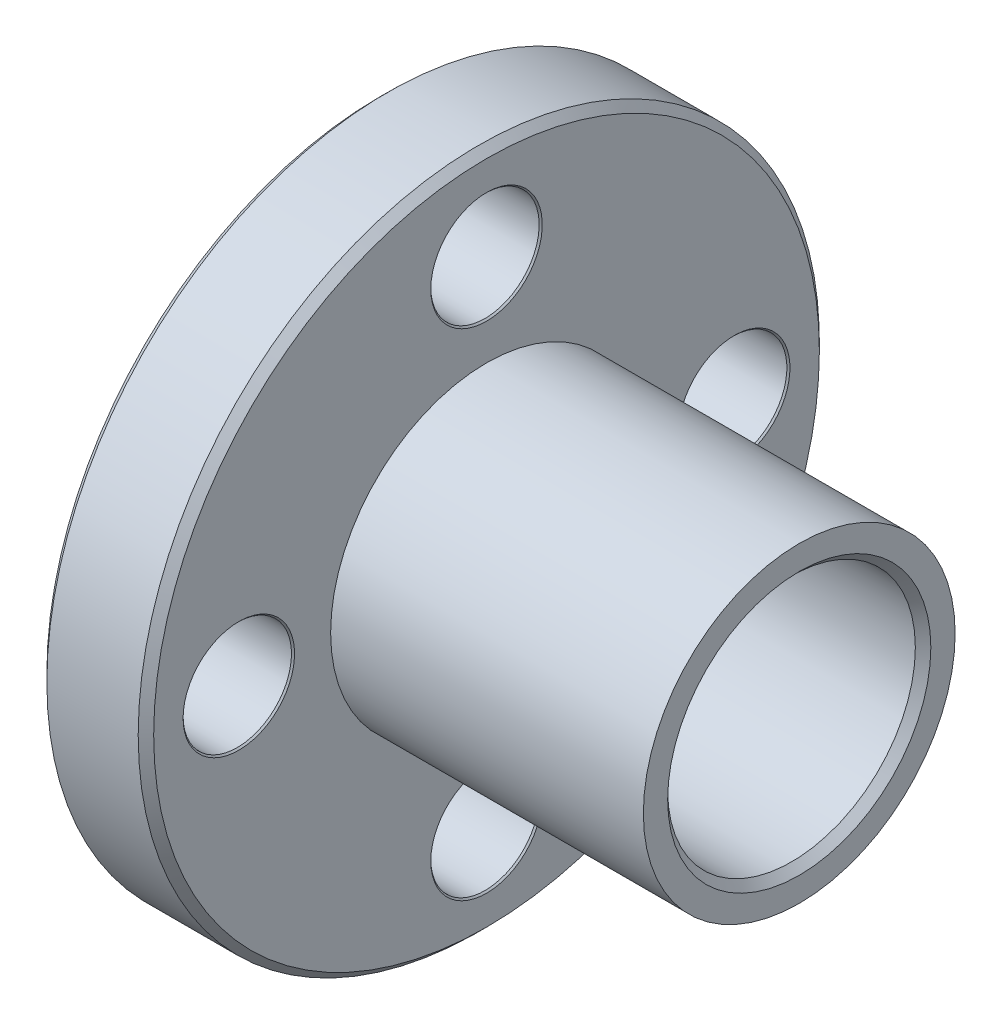
ISO-10303-21;
HEADER;
FILE_DESCRIPTION(('STEP AP214'),'2;1');
FILE_NAME('part.step','',(''),(''),'','','');
FILE_SCHEMA(('AUTOMOTIVE_DESIGN { 1 0 10303 214 1 1 1 1 }'));
ENDSEC;
DATA;
#1=APPLICATION_CONTEXT('core data for automotive mechanical design processes');
#2=APPLICATION_PROTOCOL_DEFINITION('international standard','automotive_design',2000,#1);
#3=PRODUCT_CONTEXT('',#1,'mechanical');
#4=PRODUCT('Part','Part','',(#3));
#5=PRODUCT_RELATED_PRODUCT_CATEGORY('part','',(#4));
#6=PRODUCT_DEFINITION_FORMATION('','',#4);
#7=PRODUCT_DEFINITION_CONTEXT('part definition',#1,'design');
#8=PRODUCT_DEFINITION('design','',#6,#7);
#9=PRODUCT_DEFINITION_SHAPE('','',#8);
#10=(LENGTH_UNIT() NAMED_UNIT(*) SI_UNIT(.MILLI.,.METRE.));
#11=(NAMED_UNIT(*) PLANE_ANGLE_UNIT() SI_UNIT($,.RADIAN.));
#12=(NAMED_UNIT(*) SI_UNIT($,.STERADIAN.) SOLID_ANGLE_UNIT());
#13=UNCERTAINTY_MEASURE_WITH_UNIT(LENGTH_MEASURE(1.E-05),#10,'distance_accuracy_value','');
#14=(GEOMETRIC_REPRESENTATION_CONTEXT(3) GLOBAL_UNCERTAINTY_ASSIGNED_CONTEXT((#13)) GLOBAL_UNIT_ASSIGNED_CONTEXT((#10,
#11,#12)) REPRESENTATION_CONTEXT('',''));
#15=CARTESIAN_POINT('',(0.,0.,0.));
#16=DIRECTION('',(0.,0.,1.));
#17=DIRECTION('',(1.,0.,0.));
#18=AXIS2_PLACEMENT_3D('',#15,#16,#17);
#19=CARTESIAN_POINT('',(7.525,0.,0.));
#20=DIRECTION('',(-1.,0.,0.));
#21=DIRECTION('',(0.,0.,1.));
#22=AXIS2_PLACEMENT_3D('',#19,#20,#21);
#23=PLANE('',#22);
#24=CARTESIAN_POINT('',(7.525,0.,0.));
#25=DIRECTION('',(-1.,0.,0.));
#26=DIRECTION('',(0.,0.,1.));
#27=AXIS2_PLACEMENT_3D('',#24,#25,#26);
#28=CIRCLE('',#27,4.25);
#29=CARTESIAN_POINT('',(7.525,0.,4.25));
#30=VERTEX_POINT('',#29);
#31=EDGE_CURVE('E75',#30,#30,#28,.T.);
#32=ORIENTED_EDGE('',*,*,#31,.T.);
#33=EDGE_LOOP('',(#32));
#34=FACE_BOUND('',#33,.T.);
#35=CARTESIAN_POINT('',(7.525,0.,0.));
#36=DIRECTION('',(-1.,0.,0.));
#37=DIRECTION('',(0.,0.,1.));
#38=AXIS2_PLACEMENT_3D('',#35,#36,#37);
#39=CIRCLE('',#38,5.035);
#40=CARTESIAN_POINT('',(7.525,0.,5.035));
#41=VERTEX_POINT('',#40);
#42=EDGE_CURVE('E54',#41,#41,#39,.T.);
#43=ORIENTED_EDGE('',*,*,#42,.F.);
#44=EDGE_LOOP('',(#43));
#45=FACE_BOUND('',#44,.T.);
#46=ADVANCED_FACE('F34',(#34,#45),#23,.F.);
#47=CARTESIAN_POINT('',(-7.525,0.,0.));
#48=DIRECTION('',(-1.,0.,0.));
#49=DIRECTION('',(0.,0.,1.));
#50=AXIS2_PLACEMENT_3D('',#47,#48,#49);
#51=CYLINDRICAL_SURFACE('',#50,5.035);
#52=CARTESIAN_POINT('',(-2.575,0.,0.));
#53=DIRECTION('',(-1.,0.,0.));
#54=DIRECTION('',(0.,0.,1.));
#55=AXIS2_PLACEMENT_3D('',#52,#53,#54);
#56=CIRCLE('',#55,5.035);
#57=CARTESIAN_POINT('',(-2.575,0.,5.035));
#58=VERTEX_POINT('',#57);
#59=EDGE_CURVE('E57',#58,#58,#56,.T.);
#60=ORIENTED_EDGE('',*,*,#59,.F.);
#61=EDGE_LOOP('',(#60));
#62=FACE_BOUND('',#61,.T.);
#63=ORIENTED_EDGE('',*,*,#42,.T.);
#64=EDGE_LOOP('',(#63));
#65=FACE_BOUND('',#64,.T.);
#66=ADVANCED_FACE('F176',(#62,#65),#51,.T.);
#67=CARTESIAN_POINT('',(-2.575,5.035,0.));
#68=DIRECTION('',(-1.,0.,0.));
#69=DIRECTION('',(0.,0.,1.));
#70=AXIS2_PLACEMENT_3D('',#67,#68,#69);
#71=PLANE('',#70);
#72=CARTESIAN_POINT('',(-2.575,0.,0.));
#73=DIRECTION('',(-1.,0.,0.));
#74=DIRECTION('',(0.,0.,1.));
#75=AXIS2_PLACEMENT_3D('',#72,#73,#74);
#76=CIRCLE('',#75,10.75);
#77=CARTESIAN_POINT('',(-2.575,0.,10.75));
#78=VERTEX_POINT('',#77);
#79=EDGE_CURVE('E41',#78,#78,#76,.F.);
#80=ORIENTED_EDGE('',*,*,#79,.T.);
#81=EDGE_LOOP('',(#80));
#82=FACE_BOUND('',#81,.T.);
#83=CARTESIAN_POINT('',(-2.575,8.,0.));
#84=DIRECTION('',(-1.,0.,0.));
#85=DIRECTION('',(0.,0.,1.));
#86=AXIS2_PLACEMENT_3D('',#83,#84,#85);
#87=CIRCLE('',#86,1.8);
#88=CARTESIAN_POINT('',(-2.575,8.,1.8));
#89=VERTEX_POINT('',#88);
#90=EDGE_CURVE('E123',#89,#89,#87,.T.);
#91=ORIENTED_EDGE('',*,*,#90,.T.);
#92=EDGE_LOOP('',(#91));
#93=FACE_BOUND('',#92,.T.);
#94=CARTESIAN_POINT('',(-2.575,0.,8.));
#95=DIRECTION('',(-1.,0.,0.));
#96=DIRECTION('',(0.,0.,1.));
#97=AXIS2_PLACEMENT_3D('',#94,#95,#96);
#98=CIRCLE('',#97,1.8);
#99=CARTESIAN_POINT('',(-2.575,0.,9.8));
#100=VERTEX_POINT('',#99);
#101=EDGE_CURVE('E111',#100,#100,#98,.T.);
#102=ORIENTED_EDGE('',*,*,#101,.T.);
#103=EDGE_LOOP('',(#102));
#104=FACE_BOUND('',#103,.T.);
#105=CARTESIAN_POINT('',(-2.575,-8.,0.));
#106=DIRECTION('',(-1.,0.,0.));
#107=DIRECTION('',(0.,0.,1.));
#108=AXIS2_PLACEMENT_3D('',#105,#106,#107);
#109=CIRCLE('',#108,1.8);
#110=CARTESIAN_POINT('',(-2.575,-8.,1.8));
#111=VERTEX_POINT('',#110);
#112=EDGE_CURVE('E99',#111,#111,#109,.T.);
#113=ORIENTED_EDGE('',*,*,#112,.T.);
#114=EDGE_LOOP('',(#113));
#115=FACE_BOUND('',#114,.T.);
#116=CARTESIAN_POINT('',(-2.575,0.,-8.));
#117=DIRECTION('',(-1.,0.,0.));
#118=DIRECTION('',(0.,0.,1.));
#119=AXIS2_PLACEMENT_3D('',#116,#117,#118);
#120=CIRCLE('',#119,1.8);
#121=CARTESIAN_POINT('',(-2.575,0.,-6.2));
#122=VERTEX_POINT('',#121);
#123=EDGE_CURVE('E87',#122,#122,#120,.T.);
#124=ORIENTED_EDGE('',*,*,#123,.T.);
#125=EDGE_LOOP('',(#124));
#126=FACE_BOUND('',#125,.T.);
#127=ORIENTED_EDGE('',*,*,#59,.T.);
#128=EDGE_LOOP('',(#127));
#129=FACE_BOUND('',#128,.T.);
#130=ADVANCED_FACE('F127',(#82,#93,#104,#115,#126,#129),#71,.F.);
#131=CARTESIAN_POINT('',(-7.525,0.,0.));
#132=DIRECTION('',(-1.,0.,0.));
#133=DIRECTION('',(0.,0.,1.));
#134=AXIS2_PLACEMENT_3D('',#131,#132,#133);
#135=CYLINDRICAL_SURFACE('',#134,11.);
#136=CARTESIAN_POINT('',(-2.825,0.,0.));
#137=DIRECTION('',(-1.,0.,0.));
#138=DIRECTION('',(0.,0.,1.));
#139=AXIS2_PLACEMENT_3D('',#136,#137,#138);
#140=CIRCLE('',#139,11.);
#141=CARTESIAN_POINT('',(-2.825,0.,11.));
#142=VERTEX_POINT('',#141);
#143=EDGE_CURVE('E45',#142,#142,#140,.T.);
#144=ORIENTED_EDGE('',*,*,#143,.T.);
#145=EDGE_LOOP('',(#144));
#146=FACE_BOUND('',#145,.T.);
#147=CARTESIAN_POINT('',(-5.775,0.,0.));
#148=DIRECTION('',(1.,0.,0.));
#149=DIRECTION('',(0.,0.,-1.));
#150=AXIS2_PLACEMENT_3D('',#147,#148,#149);
#151=CIRCLE('',#150,11.);
#152=CARTESIAN_POINT('',(-5.775,0.,-11.));
#153=VERTEX_POINT('',#152);
#154=EDGE_CURVE('E49',#153,#153,#151,.T.);
#155=ORIENTED_EDGE('',*,*,#154,.T.);
#156=EDGE_LOOP('',(#155));
#157=FACE_BOUND('',#156,.T.);
#158=ADVANCED_FACE('F154',(#146,#157),#135,.T.);
#159=CARTESIAN_POINT('',(-6.025,11.,0.));
#160=DIRECTION('',(1.,0.,0.));
#161=DIRECTION('',(0.,0.,-1.));
#162=AXIS2_PLACEMENT_3D('',#159,#160,#161);
#163=PLANE('',#162);
#164=CARTESIAN_POINT('',(-6.025,0.,0.));
#165=DIRECTION('',(1.,0.,0.));
#166=DIRECTION('',(0.,0.,-1.));
#167=AXIS2_PLACEMENT_3D('',#164,#165,#166);
#168=CIRCLE('',#167,10.75);
#169=CARTESIAN_POINT('',(-6.025,0.,-10.75));
#170=VERTEX_POINT('',#169);
#171=EDGE_CURVE('E10',#170,#170,#168,.F.);
#172=ORIENTED_EDGE('',*,*,#171,.T.);
#173=EDGE_LOOP('',(#172));
#174=FACE_BOUND('',#173,.T.);
#175=CARTESIAN_POINT('',(-6.025,8.,0.));
#176=DIRECTION('',(-1.,0.,0.));
#177=DIRECTION('',(0.,0.,1.));
#178=AXIS2_PLACEMENT_3D('',#175,#176,#177);
#179=CIRCLE('',#178,1.8);
#180=CARTESIAN_POINT('',(-6.025,8.,1.8));
#181=VERTEX_POINT('',#180);
#182=EDGE_CURVE('E120',#181,#181,#179,.T.);
#183=ORIENTED_EDGE('',*,*,#182,.F.);
#184=EDGE_LOOP('',(#183));
#185=FACE_BOUND('',#184,.T.);
#186=CARTESIAN_POINT('',(-6.025,0.,8.));
#187=DIRECTION('',(-1.,0.,0.));
#188=DIRECTION('',(0.,0.,1.));
#189=AXIS2_PLACEMENT_3D('',#186,#187,#188);
#190=CIRCLE('',#189,1.8);
#191=CARTESIAN_POINT('',(-6.025,0.,9.8));
#192=VERTEX_POINT('',#191);
#193=EDGE_CURVE('E108',#192,#192,#190,.T.);
#194=ORIENTED_EDGE('',*,*,#193,.F.);
#195=EDGE_LOOP('',(#194));
#196=FACE_BOUND('',#195,.T.);
#197=CARTESIAN_POINT('',(-6.025,-8.,0.));
#198=DIRECTION('',(-1.,0.,0.));
#199=DIRECTION('',(0.,0.,1.));
#200=AXIS2_PLACEMENT_3D('',#197,#198,#199);
#201=CIRCLE('',#200,1.8);
#202=CARTESIAN_POINT('',(-6.025,-8.,1.8));
#203=VERTEX_POINT('',#202);
#204=EDGE_CURVE('E96',#203,#203,#201,.T.);
#205=ORIENTED_EDGE('',*,*,#204,.F.);
#206=EDGE_LOOP('',(#205));
#207=FACE_BOUND('',#206,.T.);
#208=CARTESIAN_POINT('',(-6.025,0.,-8.));
#209=DIRECTION('',(-1.,0.,0.));
#210=DIRECTION('',(0.,0.,1.));
#211=AXIS2_PLACEMENT_3D('',#208,#209,#210);
#212=CIRCLE('',#211,1.8);
#213=CARTESIAN_POINT('',(-6.025,0.,-6.2));
#214=VERTEX_POINT('',#213);
#215=EDGE_CURVE('E84',#214,#214,#212,.T.);
#216=ORIENTED_EDGE('',*,*,#215,.F.);
#217=EDGE_LOOP('',(#216));
#218=FACE_BOUND('',#217,.T.);
#219=CARTESIAN_POINT('',(-6.025,0.,0.));
#220=DIRECTION('',(-1.,0.,0.));
#221=DIRECTION('',(0.,0.,1.));
#222=AXIS2_PLACEMENT_3D('',#219,#220,#221);
#223=CIRCLE('',#222,5.035);
#224=CARTESIAN_POINT('',(-6.025,0.,5.035));
#225=VERTEX_POINT('',#224);
#226=EDGE_CURVE('E60',#225,#225,#223,.T.);
#227=ORIENTED_EDGE('',*,*,#226,.F.);
#228=EDGE_LOOP('',(#227));
#229=FACE_BOUND('',#228,.T.);
#230=ADVANCED_FACE('F150',(#174,#185,#196,#207,#218,#229),#163,.F.);
#231=CARTESIAN_POINT('',(-7.525,0.,0.));
#232=DIRECTION('',(-1.,0.,0.));
#233=DIRECTION('',(0.,0.,1.));
#234=AXIS2_PLACEMENT_3D('',#231,#232,#233);
#235=CYLINDRICAL_SURFACE('',#234,5.035);
#236=CARTESIAN_POINT('',(-7.525,0.,0.));
#237=DIRECTION('',(-1.,0.,0.));
#238=DIRECTION('',(0.,0.,1.));
#239=AXIS2_PLACEMENT_3D('',#236,#237,#238);
#240=CIRCLE('',#239,5.035);
#241=CARTESIAN_POINT('',(-7.525,0.,5.035));
#242=VERTEX_POINT('',#241);
#243=EDGE_CURVE('E63',#242,#242,#240,.T.);
#244=ORIENTED_EDGE('',*,*,#243,.F.);
#245=EDGE_LOOP('',(#244));
#246=FACE_BOUND('',#245,.T.);
#247=ORIENTED_EDGE('',*,*,#226,.T.);
#248=EDGE_LOOP('',(#247));
#249=FACE_BOUND('',#248,.T.);
#250=ADVANCED_FACE('F153',(#246,#249),#235,.T.);
#251=CARTESIAN_POINT('',(-7.525,5.035,0.));
#252=DIRECTION('',(1.,0.,0.));
#253=DIRECTION('',(0.,0.,-1.));
#254=AXIS2_PLACEMENT_3D('',#251,#252,#253);
#255=PLANE('',#254);
#256=CARTESIAN_POINT('',(-7.525,0.,0.));
#257=DIRECTION('',(-1.,0.,0.));
#258=DIRECTION('',(0.,0.,1.));
#259=AXIS2_PLACEMENT_3D('',#256,#257,#258);
#260=CIRCLE('',#259,4.25);
#261=CARTESIAN_POINT('',(-7.525,0.,4.25));
#262=VERTEX_POINT('',#261);
#263=EDGE_CURVE('E72',#262,#262,#260,.T.);
#264=ORIENTED_EDGE('',*,*,#263,.F.);
#265=EDGE_LOOP('',(#264));
#266=FACE_BOUND('',#265,.T.);
#267=ORIENTED_EDGE('',*,*,#243,.T.);
#268=EDGE_LOOP('',(#267));
#269=FACE_BOUND('',#268,.T.);
#270=ADVANCED_FACE('F165',(#266,#269),#255,.F.);
#271=CARTESIAN_POINT('',(7.27499999999999,0.,0.));
#272=DIRECTION('',(1.,0.,0.));
#273=DIRECTION('',(0.,0.,-1.));
#274=AXIS2_PLACEMENT_3D('',#271,#272,#273);
#275=CONICAL_SURFACE('',#274,4.,0.785398163397434);
#276=ORIENTED_EDGE('',*,*,#31,.F.);
#277=EDGE_LOOP('',(#276));
#278=FACE_BOUND('',#277,.T.);
#279=CARTESIAN_POINT('',(7.27499999999999,0.,0.));
#280=DIRECTION('',(-1.,0.,0.));
#281=DIRECTION('',(0.,0.,1.));
#282=AXIS2_PLACEMENT_3D('',#279,#280,#281);
#283=CIRCLE('',#282,4.);
#284=CARTESIAN_POINT('',(7.27499999999999,0.,4.));
#285=VERTEX_POINT('',#284);
#286=EDGE_CURVE('E66',#285,#285,#283,.T.);
#287=ORIENTED_EDGE('',*,*,#286,.T.);
#288=EDGE_LOOP('',(#287));
#289=FACE_BOUND('',#288,.T.);
#290=ADVANCED_FACE('F171',(#278,#289),#275,.F.);
#291=CARTESIAN_POINT('',(-7.525,0.,0.));
#292=DIRECTION('',(-1.,0.,0.));
#293=DIRECTION('',(0.,0.,1.));
#294=AXIS2_PLACEMENT_3D('',#291,#292,#293);
#295=CYLINDRICAL_SURFACE('',#294,4.);
#296=ORIENTED_EDGE('',*,*,#286,.F.);
#297=EDGE_LOOP('',(#296));
#298=FACE_BOUND('',#297,.T.);
#299=CARTESIAN_POINT('',(-7.275,0.,0.));
#300=DIRECTION('',(-1.,0.,0.));
#301=DIRECTION('',(0.,0.,1.));
#302=AXIS2_PLACEMENT_3D('',#299,#300,#301);
#303=CIRCLE('',#302,4.);
#304=CARTESIAN_POINT('',(-7.275,0.,4.));
#305=VERTEX_POINT('',#304);
#306=EDGE_CURVE('E69',#305,#305,#303,.T.);
#307=ORIENTED_EDGE('',*,*,#306,.T.);
#308=EDGE_LOOP('',(#307));
#309=FACE_BOUND('',#308,.T.);
#310=ADVANCED_FACE('F234',(#298,#309),#295,.F.);
#311=CARTESIAN_POINT('',(-7.525,0.,0.));
#312=DIRECTION('',(-1.,0.,0.));
#313=DIRECTION('',(0.,0.,1.));
#314=AXIS2_PLACEMENT_3D('',#311,#312,#313);
#315=CONICAL_SURFACE('',#314,4.25,0.785398163397455);
#316=ORIENTED_EDGE('',*,*,#306,.F.);
#317=EDGE_LOOP('',(#316));
#318=FACE_BOUND('',#317,.T.);
#319=ORIENTED_EDGE('',*,*,#263,.T.);
#320=EDGE_LOOP('',(#319));
#321=FACE_BOUND('',#320,.T.);
#322=ADVANCED_FACE('F244',(#318,#321),#315,.F.);
#323=CARTESIAN_POINT('',(-2.625,0.,-8.));
#324=DIRECTION('',(1.,0.,0.));
#325=DIRECTION('',(0.,0.,-1.));
#326=AXIS2_PLACEMENT_3D('',#323,#324,#325);
#327=CONICAL_SURFACE('',#326,1.75,0.785398163397444);
#328=ORIENTED_EDGE('',*,*,#123,.F.);
#329=EDGE_LOOP('',(#328));
#330=FACE_BOUND('',#329,.T.);
#331=CARTESIAN_POINT('',(-2.625,0.,-8.));
#332=DIRECTION('',(-1.,0.,0.));
#333=DIRECTION('',(0.,0.,1.));
#334=AXIS2_PLACEMENT_3D('',#331,#332,#333);
#335=CIRCLE('',#334,1.75);
#336=CARTESIAN_POINT('',(-2.625,0.,-6.25));
#337=VERTEX_POINT('',#336);
#338=EDGE_CURVE('E78',#337,#337,#335,.T.);
#339=ORIENTED_EDGE('',*,*,#338,.T.);
#340=EDGE_LOOP('',(#339));
#341=FACE_BOUND('',#340,.T.);
#342=ADVANCED_FACE('F254',(#330,#341),#327,.F.);
#343=CARTESIAN_POINT('',(-6.025,0.,-8.));
#344=DIRECTION('',(-1.,0.,0.));
#345=DIRECTION('',(0.,0.,1.));
#346=AXIS2_PLACEMENT_3D('',#343,#344,#345);
#347=CYLINDRICAL_SURFACE('',#346,1.75);
#348=ORIENTED_EDGE('',*,*,#338,.F.);
#349=EDGE_LOOP('',(#348));
#350=FACE_BOUND('',#349,.T.);
#351=CARTESIAN_POINT('',(-5.975,0.,-8.));
#352=DIRECTION('',(-1.,0.,0.));
#353=DIRECTION('',(0.,0.,1.));
#354=AXIS2_PLACEMENT_3D('',#351,#352,#353);
#355=CIRCLE('',#354,1.75);
#356=CARTESIAN_POINT('',(-5.975,0.,-6.25));
#357=VERTEX_POINT('',#356);
#358=EDGE_CURVE('E81',#357,#357,#355,.T.);
#359=ORIENTED_EDGE('',*,*,#358,.T.);
#360=EDGE_LOOP('',(#359));
#361=FACE_BOUND('',#360,.T.);
#362=ADVANCED_FACE('F264',(#350,#361),#347,.F.);
#363=CARTESIAN_POINT('',(-6.025,0.,-8.));
#364=DIRECTION('',(-1.,0.,0.));
#365=DIRECTION('',(0.,0.,1.));
#366=AXIS2_PLACEMENT_3D('',#363,#364,#365);
#367=CONICAL_SURFACE('',#366,1.8,0.785398163397457);
#368=ORIENTED_EDGE('',*,*,#358,.F.);
#369=EDGE_LOOP('',(#368));
#370=FACE_BOUND('',#369,.T.);
#371=ORIENTED_EDGE('',*,*,#215,.T.);
#372=EDGE_LOOP('',(#371));
#373=FACE_BOUND('',#372,.T.);
#374=ADVANCED_FACE('F274',(#370,#373),#367,.F.);
#375=CARTESIAN_POINT('',(-2.625,-8.,0.));
#376=DIRECTION('',(1.,0.,0.));
#377=DIRECTION('',(0.,0.,-1.));
#378=AXIS2_PLACEMENT_3D('',#375,#376,#377);
#379=CONICAL_SURFACE('',#378,1.75,0.785398163397448);
#380=ORIENTED_EDGE('',*,*,#112,.F.);
#381=EDGE_LOOP('',(#380));
#382=FACE_BOUND('',#381,.T.);
#383=CARTESIAN_POINT('',(-2.625,-8.,0.));
#384=DIRECTION('',(-1.,0.,0.));
#385=DIRECTION('',(0.,0.,1.));
#386=AXIS2_PLACEMENT_3D('',#383,#384,#385);
#387=CIRCLE('',#386,1.75);
#388=CARTESIAN_POINT('',(-2.625,-8.,1.75));
#389=VERTEX_POINT('',#388);
#390=EDGE_CURVE('E90',#389,#389,#387,.T.);
#391=ORIENTED_EDGE('',*,*,#390,.T.);
#392=EDGE_LOOP('',(#391));
#393=FACE_BOUND('',#392,.T.);
#394=ADVANCED_FACE('F284',(#382,#393),#379,.F.);
#395=CARTESIAN_POINT('',(-6.025,-8.,0.));
#396=DIRECTION('',(-1.,0.,0.));
#397=DIRECTION('',(0.,0.,1.));
#398=AXIS2_PLACEMENT_3D('',#395,#396,#397);
#399=CYLINDRICAL_SURFACE('',#398,1.75);
#400=ORIENTED_EDGE('',*,*,#390,.F.);
#401=EDGE_LOOP('',(#400));
#402=FACE_BOUND('',#401,.T.);
#403=CARTESIAN_POINT('',(-5.975,-8.,0.));
#404=DIRECTION('',(-1.,0.,0.));
#405=DIRECTION('',(0.,0.,1.));
#406=AXIS2_PLACEMENT_3D('',#403,#404,#405);
#407=CIRCLE('',#406,1.75);
#408=CARTESIAN_POINT('',(-5.975,-8.,1.75));
#409=VERTEX_POINT('',#408);
#410=EDGE_CURVE('E93',#409,#409,#407,.T.);
#411=ORIENTED_EDGE('',*,*,#410,.T.);
#412=EDGE_LOOP('',(#411));
#413=FACE_BOUND('',#412,.T.);
#414=ADVANCED_FACE('F294',(#402,#413),#399,.F.);
#415=CARTESIAN_POINT('',(-6.025,-8.,0.));
#416=DIRECTION('',(-1.,0.,0.));
#417=DIRECTION('',(0.,0.,1.));
#418=AXIS2_PLACEMENT_3D('',#415,#416,#417);
#419=CONICAL_SURFACE('',#418,1.8,0.785398163397457);
#420=ORIENTED_EDGE('',*,*,#410,.F.);
#421=EDGE_LOOP('',(#420));
#422=FACE_BOUND('',#421,.T.);
#423=ORIENTED_EDGE('',*,*,#204,.T.);
#424=EDGE_LOOP('',(#423));
#425=FACE_BOUND('',#424,.T.);
#426=ADVANCED_FACE('F304',(#422,#425),#419,.F.);
#427=CARTESIAN_POINT('',(-2.625,0.,8.));
#428=DIRECTION('',(1.,0.,0.));
#429=DIRECTION('',(0.,0.,-1.));
#430=AXIS2_PLACEMENT_3D('',#427,#428,#429);
#431=CONICAL_SURFACE('',#430,1.75,0.785398163397444);
#432=ORIENTED_EDGE('',*,*,#101,.F.);
#433=EDGE_LOOP('',(#432));
#434=FACE_BOUND('',#433,.T.);
#435=CARTESIAN_POINT('',(-2.625,0.,8.));
#436=DIRECTION('',(-1.,0.,0.));
#437=DIRECTION('',(0.,0.,1.));
#438=AXIS2_PLACEMENT_3D('',#435,#436,#437);
#439=CIRCLE('',#438,1.75);
#440=CARTESIAN_POINT('',(-2.625,0.,9.75));
#441=VERTEX_POINT('',#440);
#442=EDGE_CURVE('E102',#441,#441,#439,.T.);
#443=ORIENTED_EDGE('',*,*,#442,.T.);
#444=EDGE_LOOP('',(#443));
#445=FACE_BOUND('',#444,.T.);
#446=ADVANCED_FACE('F314',(#434,#445),#431,.F.);
#447=CARTESIAN_POINT('',(-6.025,0.,8.));
#448=DIRECTION('',(-1.,0.,0.));
#449=DIRECTION('',(0.,0.,1.));
#450=AXIS2_PLACEMENT_3D('',#447,#448,#449);
#451=CYLINDRICAL_SURFACE('',#450,1.75);
#452=ORIENTED_EDGE('',*,*,#442,.F.);
#453=EDGE_LOOP('',(#452));
#454=FACE_BOUND('',#453,.T.);
#455=CARTESIAN_POINT('',(-5.975,0.,8.));
#456=DIRECTION('',(-1.,0.,0.));
#457=DIRECTION('',(0.,0.,1.));
#458=AXIS2_PLACEMENT_3D('',#455,#456,#457);
#459=CIRCLE('',#458,1.75);
#460=CARTESIAN_POINT('',(-5.975,0.,9.75));
#461=VERTEX_POINT('',#460);
#462=EDGE_CURVE('E105',#461,#461,#459,.T.);
#463=ORIENTED_EDGE('',*,*,#462,.T.);
#464=EDGE_LOOP('',(#463));
#465=FACE_BOUND('',#464,.T.);
#466=ADVANCED_FACE('F324',(#454,#465),#451,.F.);
#467=CARTESIAN_POINT('',(-6.025,0.,8.));
#468=DIRECTION('',(-1.,0.,0.));
#469=DIRECTION('',(0.,0.,1.));
#470=AXIS2_PLACEMENT_3D('',#467,#468,#469);
#471=CONICAL_SURFACE('',#470,1.8,0.785398163397457);
#472=ORIENTED_EDGE('',*,*,#462,.F.);
#473=EDGE_LOOP('',(#472));
#474=FACE_BOUND('',#473,.T.);
#475=ORIENTED_EDGE('',*,*,#193,.T.);
#476=EDGE_LOOP('',(#475));
#477=FACE_BOUND('',#476,.T.);
#478=ADVANCED_FACE('F134',(#474,#477),#471,.F.);
#479=CARTESIAN_POINT('',(-2.625,8.,0.));
#480=DIRECTION('',(1.,0.,0.));
#481=DIRECTION('',(0.,0.,-1.));
#482=AXIS2_PLACEMENT_3D('',#479,#480,#481);
#483=CONICAL_SURFACE('',#482,1.75,0.78539816339744);
#484=ORIENTED_EDGE('',*,*,#90,.F.);
#485=EDGE_LOOP('',(#484));
#486=FACE_BOUND('',#485,.T.);
#487=CARTESIAN_POINT('',(-2.625,8.,0.));
#488=DIRECTION('',(-1.,0.,0.));
#489=DIRECTION('',(0.,0.,1.));
#490=AXIS2_PLACEMENT_3D('',#487,#488,#489);
#491=CIRCLE('',#490,1.75);
#492=CARTESIAN_POINT('',(-2.625,8.,1.75));
#493=VERTEX_POINT('',#492);
#494=EDGE_CURVE('E114',#493,#493,#491,.T.);
#495=ORIENTED_EDGE('',*,*,#494,.T.);
#496=EDGE_LOOP('',(#495));
#497=FACE_BOUND('',#496,.T.);
#498=ADVANCED_FACE('F130',(#486,#497),#483,.F.);
#499=CARTESIAN_POINT('',(-6.025,8.,0.));
#500=DIRECTION('',(-1.,0.,0.));
#501=DIRECTION('',(0.,0.,1.));
#502=AXIS2_PLACEMENT_3D('',#499,#500,#501);
#503=CYLINDRICAL_SURFACE('',#502,1.75);
#504=ORIENTED_EDGE('',*,*,#494,.F.);
#505=EDGE_LOOP('',(#504));
#506=FACE_BOUND('',#505,.T.);
#507=CARTESIAN_POINT('',(-5.975,8.,0.));
#508=DIRECTION('',(-1.,0.,0.));
#509=DIRECTION('',(0.,0.,1.));
#510=AXIS2_PLACEMENT_3D('',#507,#508,#509);
#511=CIRCLE('',#510,1.75);
#512=CARTESIAN_POINT('',(-5.975,8.,1.75));
#513=VERTEX_POINT('',#512);
#514=EDGE_CURVE('E117',#513,#513,#511,.T.);
#515=ORIENTED_EDGE('',*,*,#514,.T.);
#516=EDGE_LOOP('',(#515));
#517=FACE_BOUND('',#516,.T.);
#518=ADVANCED_FACE('F133',(#506,#517),#503,.F.);
#519=CARTESIAN_POINT('',(-6.025,8.,0.));
#520=DIRECTION('',(-1.,0.,0.));
#521=DIRECTION('',(0.,0.,1.));
#522=AXIS2_PLACEMENT_3D('',#519,#520,#521);
#523=CONICAL_SURFACE('',#522,1.8,0.785398163397448);
#524=ORIENTED_EDGE('',*,*,#514,.F.);
#525=EDGE_LOOP('',(#524));
#526=FACE_BOUND('',#525,.T.);
#527=ORIENTED_EDGE('',*,*,#182,.T.);
#528=EDGE_LOOP('',(#527));
#529=FACE_BOUND('',#528,.T.);
#530=ADVANCED_FACE('F140',(#526,#529),#523,.F.);
#531=CARTESIAN_POINT('',(-2.825,0.,0.));
#532=DIRECTION('',(-1.,0.,0.));
#533=DIRECTION('',(0.,0.,1.));
#534=AXIS2_PLACEMENT_3D('',#531,#532,#533);
#535=CONICAL_SURFACE('',#534,11.,0.785398163397455);
#536=ORIENTED_EDGE('',*,*,#79,.F.);
#537=EDGE_LOOP('',(#536));
#538=FACE_BOUND('',#537,.T.);
#539=ORIENTED_EDGE('',*,*,#143,.F.);
#540=EDGE_LOOP('',(#539));
#541=FACE_BOUND('',#540,.T.);
#542=ADVANCED_FACE('F146',(#538,#541),#535,.T.);
#543=CARTESIAN_POINT('',(-6.025,0.,0.));
#544=DIRECTION('',(1.,0.,0.));
#545=DIRECTION('',(0.,0.,-1.));
#546=AXIS2_PLACEMENT_3D('',#543,#544,#545);
#547=CONICAL_SURFACE('',#546,10.75,0.785398163397441);
#548=ORIENTED_EDGE('',*,*,#154,.F.);
#549=EDGE_LOOP('',(#548));
#550=FACE_BOUND('',#549,.T.);
#551=ORIENTED_EDGE('',*,*,#171,.F.);
#552=EDGE_LOOP('',(#551));
#553=FACE_BOUND('',#552,.T.);
#554=ADVANCED_FACE('F36',(#550,#553),#547,.T.);
#555=CLOSED_SHELL('',(#46,#66,#130,#158,#230,#250,#270,#290,#310,#322,#342,#362,#374,#394,#414,
#426,#446,#466,#478,#498,#518,#530,#542,#554));
#556=MANIFOLD_SOLID_BREP('B2',#555);
#557=ADVANCED_BREP_SHAPE_REPRESENTATION('',(#18,#556),#14);
#558=SHAPE_DEFINITION_REPRESENTATION(#9,#557);
ENDSEC;
END-ISO-10303-21;
